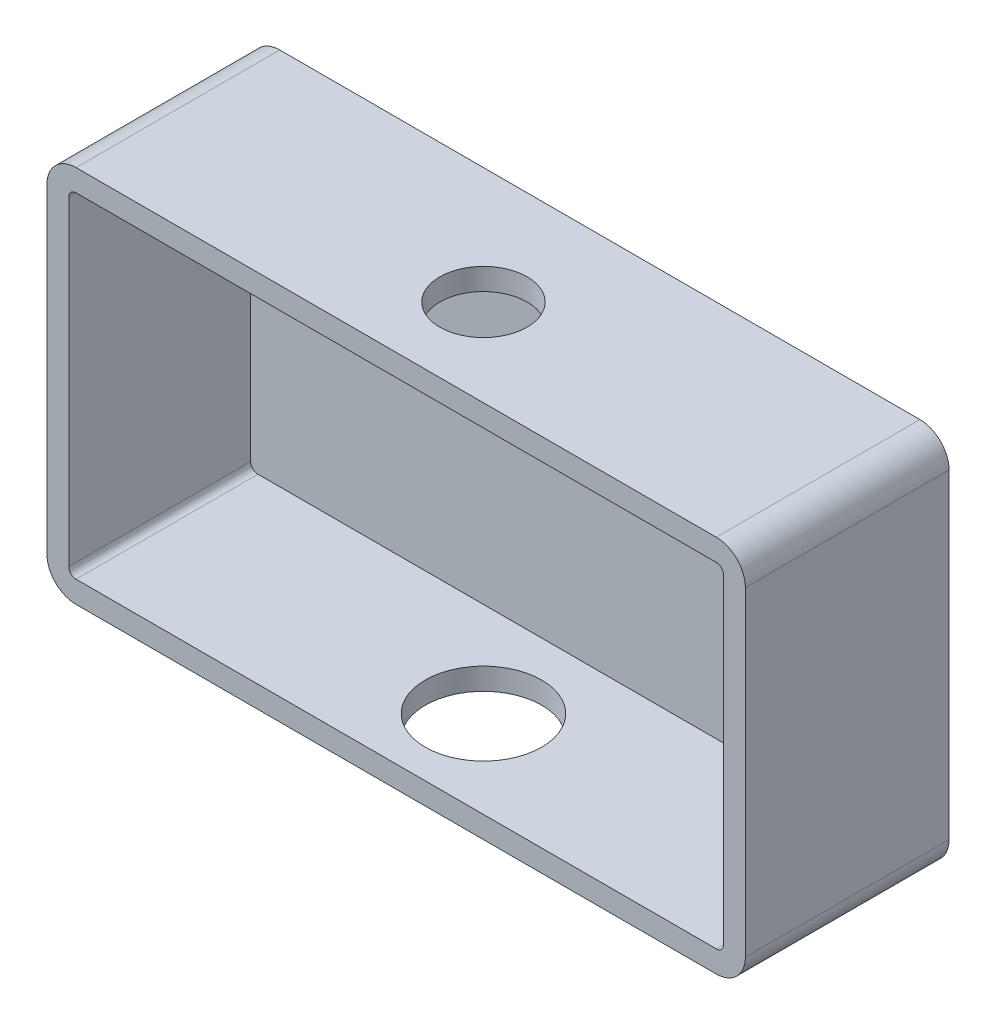
ISO-10303-21;
HEADER;
FILE_DESCRIPTION(('STEP AP214'),'2;1');
FILE_NAME('part.step','',(''),(''),'','','');
FILE_SCHEMA(('AUTOMOTIVE_DESIGN { 1 0 10303 214 1 1 1 1 }'));
ENDSEC;
DATA;
#1=APPLICATION_CONTEXT('core data for automotive mechanical design processes');
#2=APPLICATION_PROTOCOL_DEFINITION('international standard','automotive_design',2000,#1);
#3=PRODUCT_CONTEXT('',#1,'mechanical');
#4=PRODUCT('Part','Part','',(#3));
#5=PRODUCT_RELATED_PRODUCT_CATEGORY('part','',(#4));
#6=PRODUCT_DEFINITION_FORMATION('','',#4);
#7=PRODUCT_DEFINITION_CONTEXT('part definition',#1,'design');
#8=PRODUCT_DEFINITION('design','',#6,#7);
#9=PRODUCT_DEFINITION_SHAPE('','',#8);
#10=(LENGTH_UNIT() NAMED_UNIT(*) SI_UNIT(.MILLI.,.METRE.));
#11=(NAMED_UNIT(*) PLANE_ANGLE_UNIT() SI_UNIT($,.RADIAN.));
#12=(NAMED_UNIT(*) SI_UNIT($,.STERADIAN.) SOLID_ANGLE_UNIT());
#13=UNCERTAINTY_MEASURE_WITH_UNIT(LENGTH_MEASURE(1.E-05),#10,'distance_accuracy_value','');
#14=(GEOMETRIC_REPRESENTATION_CONTEXT(3) GLOBAL_UNCERTAINTY_ASSIGNED_CONTEXT((#13)) GLOBAL_UNIT_ASSIGNED_CONTEXT((#10,
#11,#12)) REPRESENTATION_CONTEXT('',''));
#15=CARTESIAN_POINT('',(0.,0.,0.));
#16=DIRECTION('',(0.,0.,1.));
#17=DIRECTION('',(1.,0.,0.));
#18=AXIS2_PLACEMENT_3D('',#15,#16,#17);
#19=CARTESIAN_POINT('',(0.,26.,14.));
#20=DIRECTION('',(1.,0.,0.));
#21=DIRECTION('',(0.,0.,-1.));
#22=AXIS2_PLACEMENT_3D('',#19,#20,#21);
#23=PLANE('',#22);
#24=DIRECTION('',(0.,-1.,0.));
#25=VECTOR('',#24,1.);
#26=CARTESIAN_POINT('',(0.,26.,14.));
#27=LINE('',#26,#25);
#28=CARTESIAN_POINT('',(0.,24.,14.));
#29=VERTEX_POINT('',#28);
#30=CARTESIAN_POINT('',(0.,2.00000000000001,14.));
#31=VERTEX_POINT('',#30);
#32=EDGE_CURVE('E205',#29,#31,#27,.T.);
#33=ORIENTED_EDGE('',*,*,#32,.F.);
#34=DIRECTION('',(0.,0.,-1.));
#35=VECTOR('',#34,1.);
#36=CARTESIAN_POINT('',(0.,24.,14.));
#37=LINE('',#36,#35);
#38=CARTESIAN_POINT('',(0.,24.,0.));
#39=VERTEX_POINT('',#38);
#40=EDGE_CURVE('E230',#29,#39,#37,.T.);
#41=ORIENTED_EDGE('',*,*,#40,.T.);
#42=DIRECTION('',(0.,-1.,0.));
#43=VECTOR('',#42,1.);
#44=CARTESIAN_POINT('',(0.,26.,0.));
#45=LINE('',#44,#43);
#46=CARTESIAN_POINT('',(0.,2.00000000000001,0.));
#47=VERTEX_POINT('',#46);
#48=EDGE_CURVE('E218',#39,#47,#45,.T.);
#49=ORIENTED_EDGE('',*,*,#48,.T.);
#50=DIRECTION('',(0.,0.,-1.));
#51=VECTOR('',#50,1.);
#52=CARTESIAN_POINT('',(0.,2.,14.));
#53=LINE('',#52,#51);
#54=EDGE_CURVE('E217',#47,#31,#53,.F.);
#55=ORIENTED_EDGE('',*,*,#54,.T.);
#56=EDGE_LOOP('',(#33,#41,#49,#55));
#57=FACE_BOUND('',#56,.T.);
#58=ADVANCED_FACE('F39',(#57),#23,.F.);
#59=CARTESIAN_POINT('',(0.,0.,14.));
#60=DIRECTION('',(0.,1.,0.));
#61=DIRECTION('',(0.,0.,1.));
#62=AXIS2_PLACEMENT_3D('',#59,#60,#61);
#63=PLANE('',#62);
#64=CARTESIAN_POINT('',(24.,0.,8.));
#65=DIRECTION('',(0.,-1.,0.));
#66=DIRECTION('',(0.,0.,-1.));
#67=AXIS2_PLACEMENT_3D('',#64,#65,#66);
#68=CIRCLE('',#67,4.);
#69=CARTESIAN_POINT('',(24.,0.,4.));
#70=VERTEX_POINT('',#69);
#71=EDGE_CURVE('E272',#70,#70,#68,.T.);
#72=ORIENTED_EDGE('',*,*,#71,.F.);
#73=EDGE_LOOP('',(#72));
#74=FACE_BOUND('',#73,.T.);
#75=DIRECTION('',(1.,0.,0.));
#76=VECTOR('',#75,1.);
#77=CARTESIAN_POINT('',(0.,0.,0.));
#78=LINE('',#77,#76);
#79=CARTESIAN_POINT('',(2.,0.,0.));
#80=VERTEX_POINT('',#79);
#81=CARTESIAN_POINT('',(46.,0.,0.));
#82=VERTEX_POINT('',#81);
#83=EDGE_CURVE('E221',#80,#82,#78,.T.);
#84=ORIENTED_EDGE('',*,*,#83,.T.);
#85=DIRECTION('',(0.,0.,-1.));
#86=VECTOR('',#85,1.);
#87=CARTESIAN_POINT('',(46.,0.,14.));
#88=LINE('',#87,#86);
#89=CARTESIAN_POINT('',(46.,0.,14.));
#90=VERTEX_POINT('',#89);
#91=EDGE_CURVE('E11',#82,#90,#88,.F.);
#92=ORIENTED_EDGE('',*,*,#91,.T.);
#93=DIRECTION('',(1.,0.,0.));
#94=VECTOR('',#93,1.);
#95=CARTESIAN_POINT('',(0.,0.,14.));
#96=LINE('',#95,#94);
#97=CARTESIAN_POINT('',(2.,0.,14.));
#98=VERTEX_POINT('',#97);
#99=EDGE_CURVE('E208',#98,#90,#96,.T.);
#100=ORIENTED_EDGE('',*,*,#99,.F.);
#101=DIRECTION('',(0.,0.,-1.));
#102=VECTOR('',#101,1.);
#103=CARTESIAN_POINT('',(2.,0.,14.));
#104=LINE('',#103,#102);
#105=EDGE_CURVE('E48',#98,#80,#104,.T.);
#106=ORIENTED_EDGE('',*,*,#105,.T.);
#107=EDGE_LOOP('',(#84,#92,#100,#106));
#108=FACE_BOUND('',#107,.T.);
#109=ADVANCED_FACE('F326',(#74,#108),#63,.F.);
#110=CARTESIAN_POINT('',(48.,0.,14.));
#111=DIRECTION('',(-1.,0.,0.));
#112=DIRECTION('',(0.,0.,1.));
#113=AXIS2_PLACEMENT_3D('',#110,#111,#112);
#114=PLANE('',#113);
#115=DIRECTION('',(0.,1.,0.));
#116=VECTOR('',#115,1.);
#117=CARTESIAN_POINT('',(48.,0.,0.));
#118=LINE('',#117,#116);
#119=CARTESIAN_POINT('',(48.,2.,0.));
#120=VERTEX_POINT('',#119);
#121=CARTESIAN_POINT('',(48.,24.,0.));
#122=VERTEX_POINT('',#121);
#123=EDGE_CURVE('E225',#120,#122,#118,.T.);
#124=ORIENTED_EDGE('',*,*,#123,.T.);
#125=DIRECTION('',(0.,0.,-1.));
#126=VECTOR('',#125,1.);
#127=CARTESIAN_POINT('',(48.,24.,14.));
#128=LINE('',#127,#126);
#129=CARTESIAN_POINT('',(48.,24.,14.));
#130=VERTEX_POINT('',#129);
#131=EDGE_CURVE('E64',#122,#130,#128,.F.);
#132=ORIENTED_EDGE('',*,*,#131,.T.);
#133=DIRECTION('',(0.,1.,0.));
#134=VECTOR('',#133,1.);
#135=CARTESIAN_POINT('',(48.,0.,14.));
#136=LINE('',#135,#134);
#137=CARTESIAN_POINT('',(48.,2.,14.));
#138=VERTEX_POINT('',#137);
#139=EDGE_CURVE('E212',#138,#130,#136,.T.);
#140=ORIENTED_EDGE('',*,*,#139,.F.);
#141=DIRECTION('',(0.,0.,-1.));
#142=VECTOR('',#141,1.);
#143=CARTESIAN_POINT('',(48.,2.,14.));
#144=LINE('',#143,#142);
#145=EDGE_CURVE('E254',#138,#120,#144,.T.);
#146=ORIENTED_EDGE('',*,*,#145,.T.);
#147=EDGE_LOOP('',(#124,#132,#140,#146));
#148=FACE_BOUND('',#147,.T.);
#149=ADVANCED_FACE('F332',(#148),#114,.F.);
#150=CARTESIAN_POINT('',(48.,26.,14.));
#151=DIRECTION('',(0.,-1.,0.));
#152=DIRECTION('',(0.,0.,-1.));
#153=AXIS2_PLACEMENT_3D('',#150,#151,#152);
#154=PLANE('',#153);
#155=CARTESIAN_POINT('',(24.,26.,8.));
#156=DIRECTION('',(0.,-1.,0.));
#157=DIRECTION('',(0.,0.,-1.));
#158=AXIS2_PLACEMENT_3D('',#155,#156,#157);
#159=CIRCLE('',#158,3.);
#160=CARTESIAN_POINT('',(24.,26.,5.));
#161=VERTEX_POINT('',#160);
#162=EDGE_CURVE('E262',#161,#161,#159,.T.);
#163=ORIENTED_EDGE('',*,*,#162,.T.);
#164=EDGE_LOOP('',(#163));
#165=FACE_BOUND('',#164,.T.);
#166=DIRECTION('',(-1.,0.,0.));
#167=VECTOR('',#166,1.);
#168=CARTESIAN_POINT('',(48.,26.,0.));
#169=LINE('',#168,#167);
#170=CARTESIAN_POINT('',(46.,26.,0.));
#171=VERTEX_POINT('',#170);
#172=CARTESIAN_POINT('',(2.,26.,0.));
#173=VERTEX_POINT('',#172);
#174=EDGE_CURVE('E209',#171,#173,#169,.T.);
#175=ORIENTED_EDGE('',*,*,#174,.T.);
#176=DIRECTION('',(0.,0.,-1.));
#177=VECTOR('',#176,1.);
#178=CARTESIAN_POINT('',(2.,26.,14.));
#179=LINE('',#178,#177);
#180=CARTESIAN_POINT('',(2.,26.,14.));
#181=VERTEX_POINT('',#180);
#182=EDGE_CURVE('E244',#173,#181,#179,.F.);
#183=ORIENTED_EDGE('',*,*,#182,.T.);
#184=DIRECTION('',(-1.,0.,0.));
#185=VECTOR('',#184,1.);
#186=CARTESIAN_POINT('',(48.,26.,14.));
#187=LINE('',#186,#185);
#188=CARTESIAN_POINT('',(46.,26.,14.));
#189=VERTEX_POINT('',#188);
#190=EDGE_CURVE('E214',#189,#181,#187,.T.);
#191=ORIENTED_EDGE('',*,*,#190,.F.);
#192=DIRECTION('',(0.,0.,-1.));
#193=VECTOR('',#192,1.);
#194=CARTESIAN_POINT('',(46.,26.,14.));
#195=LINE('',#194,#193);
#196=EDGE_CURVE('E241',#189,#171,#195,.T.);
#197=ORIENTED_EDGE('',*,*,#196,.T.);
#198=EDGE_LOOP('',(#175,#183,#191,#197));
#199=FACE_BOUND('',#198,.T.);
#200=ADVANCED_FACE('F366',(#165,#199),#154,.F.);
#201=CARTESIAN_POINT('',(0.,0.,14.));
#202=DIRECTION('',(0.,0.,1.));
#203=DIRECTION('',(1.,0.,0.));
#204=AXIS2_PLACEMENT_3D('',#201,#202,#203);
#205=PLANE('',#204);
#206=DIRECTION('',(-1.,0.,0.));
#207=VECTOR('',#206,1.);
#208=CARTESIAN_POINT('',(48.,24.5,14.));
#209=LINE('',#208,#207);
#210=CARTESIAN_POINT('',(46.,24.5,14.));
#211=VERTEX_POINT('',#210);
#212=CARTESIAN_POINT('',(2.,24.5,14.));
#213=VERTEX_POINT('',#212);
#214=EDGE_CURVE('E182',#211,#213,#209,.T.);
#215=ORIENTED_EDGE('',*,*,#214,.F.);
#216=CARTESIAN_POINT('',(46.,24.,14.));
#217=DIRECTION('',(0.,0.,1.));
#218=DIRECTION('',(1.,0.,0.));
#219=AXIS2_PLACEMENT_3D('',#216,#217,#218);
#220=CIRCLE('',#219,0.5);
#221=CARTESIAN_POINT('',(46.5,24.,14.));
#222=VERTEX_POINT('',#221);
#223=EDGE_CURVE('E197',#222,#211,#220,.T.);
#224=ORIENTED_EDGE('',*,*,#223,.F.);
#225=DIRECTION('',(0.,1.,0.));
#226=VECTOR('',#225,1.);
#227=CARTESIAN_POINT('',(46.5,0.,14.));
#228=LINE('',#227,#226);
#229=CARTESIAN_POINT('',(46.5,2.,14.));
#230=VERTEX_POINT('',#229);
#231=EDGE_CURVE('E56',#230,#222,#228,.T.);
#232=ORIENTED_EDGE('',*,*,#231,.F.);
#233=CARTESIAN_POINT('',(46.,2.,14.));
#234=DIRECTION('',(0.,0.,1.));
#235=DIRECTION('',(1.,0.,0.));
#236=AXIS2_PLACEMENT_3D('',#233,#234,#235);
#237=CIRCLE('',#236,0.5);
#238=CARTESIAN_POINT('',(46.,1.5,14.));
#239=VERTEX_POINT('',#238);
#240=EDGE_CURVE('E186',#239,#230,#237,.T.);
#241=ORIENTED_EDGE('',*,*,#240,.F.);
#242=DIRECTION('',(1.,0.,0.));
#243=VECTOR('',#242,1.);
#244=CARTESIAN_POINT('',(0.,1.5,14.));
#245=LINE('',#244,#243);
#246=CARTESIAN_POINT('',(2.,1.5,14.));
#247=VERTEX_POINT('',#246);
#248=EDGE_CURVE('E192',#247,#239,#245,.T.);
#249=ORIENTED_EDGE('',*,*,#248,.F.);
#250=CARTESIAN_POINT('',(2.,2.,14.));
#251=DIRECTION('',(0.,0.,1.));
#252=DIRECTION('',(1.,0.,0.));
#253=AXIS2_PLACEMENT_3D('',#250,#251,#252);
#254=CIRCLE('',#253,0.5);
#255=CARTESIAN_POINT('',(1.5,2.00000000000001,14.));
#256=VERTEX_POINT('',#255);
#257=EDGE_CURVE('E184',#256,#247,#254,.T.);
#258=ORIENTED_EDGE('',*,*,#257,.F.);
#259=DIRECTION('',(0.,-1.,0.));
#260=VECTOR('',#259,1.);
#261=CARTESIAN_POINT('',(1.5,26.,14.));
#262=LINE('',#261,#260);
#263=CARTESIAN_POINT('',(1.5,24.,14.));
#264=VERTEX_POINT('',#263);
#265=EDGE_CURVE('E177',#264,#256,#262,.T.);
#266=ORIENTED_EDGE('',*,*,#265,.F.);
#267=CARTESIAN_POINT('',(2.,24.,14.));
#268=DIRECTION('',(0.,0.,1.));
#269=DIRECTION('',(1.,0.,0.));
#270=AXIS2_PLACEMENT_3D('',#267,#268,#269);
#271=CIRCLE('',#270,0.5);
#272=EDGE_CURVE('E200',#213,#264,#271,.T.);
#273=ORIENTED_EDGE('',*,*,#272,.F.);
#274=EDGE_LOOP('',(#215,#224,#232,#241,#249,#258,#266,#273));
#275=FACE_BOUND('',#274,.T.);
#276=ORIENTED_EDGE('',*,*,#190,.T.);
#277=CARTESIAN_POINT('',(2.,24.,14.));
#278=DIRECTION('',(0.,0.,1.));
#279=DIRECTION('',(1.,0.,0.));
#280=AXIS2_PLACEMENT_3D('',#277,#278,#279);
#281=CIRCLE('',#280,2.);
#282=EDGE_CURVE('E252',#181,#29,#281,.T.);
#283=ORIENTED_EDGE('',*,*,#282,.T.);
#284=ORIENTED_EDGE('',*,*,#32,.T.);
#285=CARTESIAN_POINT('',(2.,2.,14.));
#286=DIRECTION('',(0.,0.,1.));
#287=DIRECTION('',(1.,0.,0.));
#288=AXIS2_PLACEMENT_3D('',#285,#286,#287);
#289=CIRCLE('',#288,2.);
#290=EDGE_CURVE('E246',#31,#98,#289,.T.);
#291=ORIENTED_EDGE('',*,*,#290,.T.);
#292=ORIENTED_EDGE('',*,*,#99,.T.);
#293=CARTESIAN_POINT('',(46.,2.,14.));
#294=DIRECTION('',(0.,0.,1.));
#295=DIRECTION('',(1.,0.,0.));
#296=AXIS2_PLACEMENT_3D('',#293,#294,#295);
#297=CIRCLE('',#296,2.);
#298=EDGE_CURVE('E248',#90,#138,#297,.T.);
#299=ORIENTED_EDGE('',*,*,#298,.T.);
#300=ORIENTED_EDGE('',*,*,#139,.T.);
#301=CARTESIAN_POINT('',(46.,24.,14.));
#302=DIRECTION('',(0.,0.,1.));
#303=DIRECTION('',(1.,0.,0.));
#304=AXIS2_PLACEMENT_3D('',#301,#302,#303);
#305=CIRCLE('',#304,2.);
#306=EDGE_CURVE('E250',#130,#189,#305,.T.);
#307=ORIENTED_EDGE('',*,*,#306,.T.);
#308=EDGE_LOOP('',(#276,#283,#284,#291,#292,#299,#300,#307));
#309=FACE_BOUND('',#308,.T.);
#310=ADVANCED_FACE('F296',(#275,#309),#205,.T.);
#311=CARTESIAN_POINT('',(0.,0.,0.));
#312=DIRECTION('',(0.,0.,1.));
#313=DIRECTION('',(1.,0.,0.));
#314=AXIS2_PLACEMENT_3D('',#311,#312,#313);
#315=PLANE('',#314);
#316=ORIENTED_EDGE('',*,*,#48,.F.);
#317=CARTESIAN_POINT('',(2.,24.,0.));
#318=DIRECTION('',(0.,0.,1.));
#319=DIRECTION('',(1.,0.,0.));
#320=AXIS2_PLACEMENT_3D('',#317,#318,#319);
#321=CIRCLE('',#320,2.);
#322=EDGE_CURVE('E239',#39,#173,#321,.F.);
#323=ORIENTED_EDGE('',*,*,#322,.T.);
#324=ORIENTED_EDGE('',*,*,#174,.F.);
#325=CARTESIAN_POINT('',(46.,24.,0.));
#326=DIRECTION('',(0.,0.,1.));
#327=DIRECTION('',(1.,0.,0.));
#328=AXIS2_PLACEMENT_3D('',#325,#326,#327);
#329=CIRCLE('',#328,2.);
#330=EDGE_CURVE('E237',#171,#122,#329,.F.);
#331=ORIENTED_EDGE('',*,*,#330,.T.);
#332=ORIENTED_EDGE('',*,*,#123,.F.);
#333=CARTESIAN_POINT('',(46.,2.,0.));
#334=DIRECTION('',(0.,0.,1.));
#335=DIRECTION('',(1.,0.,0.));
#336=AXIS2_PLACEMENT_3D('',#333,#334,#335);
#337=CIRCLE('',#336,2.);
#338=EDGE_CURVE('E235',#120,#82,#337,.F.);
#339=ORIENTED_EDGE('',*,*,#338,.T.);
#340=ORIENTED_EDGE('',*,*,#83,.F.);
#341=CARTESIAN_POINT('',(2.,2.,0.));
#342=DIRECTION('',(0.,0.,1.));
#343=DIRECTION('',(1.,0.,0.));
#344=AXIS2_PLACEMENT_3D('',#341,#342,#343);
#345=CIRCLE('',#344,2.);
#346=EDGE_CURVE('E233',#80,#47,#345,.F.);
#347=ORIENTED_EDGE('',*,*,#346,.T.);
#348=EDGE_LOOP('',(#316,#323,#324,#331,#332,#339,#340,#347));
#349=FACE_BOUND('',#348,.T.);
#350=ADVANCED_FACE('F342',(#349),#315,.F.);
#351=CARTESIAN_POINT('',(2.,24.,14.));
#352=DIRECTION('',(0.,0.,-1.));
#353=DIRECTION('',(-1.,0.,0.));
#354=AXIS2_PLACEMENT_3D('',#351,#352,#353);
#355=CYLINDRICAL_SURFACE('',#354,2.);
#356=ORIENTED_EDGE('',*,*,#282,.F.);
#357=ORIENTED_EDGE('',*,*,#182,.F.);
#358=ORIENTED_EDGE('',*,*,#322,.F.);
#359=ORIENTED_EDGE('',*,*,#40,.F.);
#360=EDGE_LOOP('',(#356,#357,#358,#359));
#361=FACE_BOUND('',#360,.T.);
#362=ADVANCED_FACE('F338',(#361),#355,.T.);
#363=CARTESIAN_POINT('',(46.,24.,14.));
#364=DIRECTION('',(0.,0.,-1.));
#365=DIRECTION('',(-1.,0.,0.));
#366=AXIS2_PLACEMENT_3D('',#363,#364,#365);
#367=CYLINDRICAL_SURFACE('',#366,2.);
#368=ORIENTED_EDGE('',*,*,#306,.F.);
#369=ORIENTED_EDGE('',*,*,#131,.F.);
#370=ORIENTED_EDGE('',*,*,#330,.F.);
#371=ORIENTED_EDGE('',*,*,#196,.F.);
#372=EDGE_LOOP('',(#368,#369,#370,#371));
#373=FACE_BOUND('',#372,.T.);
#374=ADVANCED_FACE('F341',(#373),#367,.T.);
#375=CARTESIAN_POINT('',(46.,2.,14.));
#376=DIRECTION('',(0.,0.,-1.));
#377=DIRECTION('',(-1.,0.,0.));
#378=AXIS2_PLACEMENT_3D('',#375,#376,#377);
#379=CYLINDRICAL_SURFACE('',#378,2.);
#380=ORIENTED_EDGE('',*,*,#298,.F.);
#381=ORIENTED_EDGE('',*,*,#91,.F.);
#382=ORIENTED_EDGE('',*,*,#338,.F.);
#383=ORIENTED_EDGE('',*,*,#145,.F.);
#384=EDGE_LOOP('',(#380,#381,#382,#383));
#385=FACE_BOUND('',#384,.T.);
#386=ADVANCED_FACE('F345',(#385),#379,.T.);
#387=CARTESIAN_POINT('',(2.,2.,14.));
#388=DIRECTION('',(0.,0.,-1.));
#389=DIRECTION('',(-1.,0.,0.));
#390=AXIS2_PLACEMENT_3D('',#387,#388,#389);
#391=CYLINDRICAL_SURFACE('',#390,2.);
#392=ORIENTED_EDGE('',*,*,#290,.F.);
#393=ORIENTED_EDGE('',*,*,#54,.F.);
#394=ORIENTED_EDGE('',*,*,#346,.F.);
#395=ORIENTED_EDGE('',*,*,#105,.F.);
#396=EDGE_LOOP('',(#392,#393,#394,#395));
#397=FACE_BOUND('',#396,.T.);
#398=ADVANCED_FACE('F41',(#397),#391,.T.);
#399=CARTESIAN_POINT('',(1.5,26.,14.));
#400=DIRECTION('',(1.,0.,0.));
#401=DIRECTION('',(0.,0.,-1.));
#402=AXIS2_PLACEMENT_3D('',#399,#400,#401);
#403=PLANE('',#402);
#404=ORIENTED_EDGE('',*,*,#265,.T.);
#405=DIRECTION('',(0.,0.,-1.));
#406=VECTOR('',#405,1.);
#407=CARTESIAN_POINT('',(1.5,2.00000000000001,14.));
#408=LINE('',#407,#406);
#409=CARTESIAN_POINT('',(1.5,2.00000000000001,1.5));
#410=VERTEX_POINT('',#409);
#411=EDGE_CURVE('E202',#410,#256,#408,.F.);
#412=ORIENTED_EDGE('',*,*,#411,.F.);
#413=DIRECTION('',(0.,-1.,0.));
#414=VECTOR('',#413,1.);
#415=CARTESIAN_POINT('',(1.5,26.,1.5));
#416=LINE('',#415,#414);
#417=CARTESIAN_POINT('',(1.5,24.,1.5));
#418=VERTEX_POINT('',#417);
#419=EDGE_CURVE('E261',#418,#410,#416,.T.);
#420=ORIENTED_EDGE('',*,*,#419,.F.);
#421=DIRECTION('',(0.,0.,-1.));
#422=VECTOR('',#421,1.);
#423=CARTESIAN_POINT('',(1.5,24.,14.));
#424=LINE('',#423,#422);
#425=EDGE_CURVE('E163',#264,#418,#424,.T.);
#426=ORIENTED_EDGE('',*,*,#425,.F.);
#427=EDGE_LOOP('',(#404,#412,#420,#426));
#428=FACE_BOUND('',#427,.T.);
#429=ADVANCED_FACE('F302',(#428),#403,.T.);
#430=CARTESIAN_POINT('',(0.,1.5,14.));
#431=DIRECTION('',(0.,1.,0.));
#432=DIRECTION('',(0.,0.,1.));
#433=AXIS2_PLACEMENT_3D('',#430,#431,#432);
#434=PLANE('',#433);
#435=CARTESIAN_POINT('',(24.,1.5,8.));
#436=DIRECTION('',(0.,1.,0.));
#437=DIRECTION('',(0.,0.,1.));
#438=AXIS2_PLACEMENT_3D('',#435,#436,#437);
#439=CIRCLE('',#438,4.);
#440=CARTESIAN_POINT('',(24.,1.5,12.));
#441=VERTEX_POINT('',#440);
#442=EDGE_CURVE('E43',#441,#441,#439,.T.);
#443=ORIENTED_EDGE('',*,*,#442,.F.);
#444=EDGE_LOOP('',(#443));
#445=FACE_BOUND('',#444,.T.);
#446=DIRECTION('',(1.,0.,0.));
#447=VECTOR('',#446,1.);
#448=CARTESIAN_POINT('',(0.,1.5,1.5));
#449=LINE('',#448,#447);
#450=CARTESIAN_POINT('',(2.,1.5,1.5));
#451=VERTEX_POINT('',#450);
#452=CARTESIAN_POINT('',(46.,1.5,1.5));
#453=VERTEX_POINT('',#452);
#454=EDGE_CURVE('E265',#451,#453,#449,.T.);
#455=ORIENTED_EDGE('',*,*,#454,.F.);
#456=DIRECTION('',(0.,0.,1.));
#457=VECTOR('',#456,1.);
#458=CARTESIAN_POINT('',(2.,1.5,14.));
#459=LINE('',#458,#457);
#460=EDGE_CURVE('E286',#247,#451,#459,.F.);
#461=ORIENTED_EDGE('',*,*,#460,.F.);
#462=ORIENTED_EDGE('',*,*,#248,.T.);
#463=DIRECTION('',(0.,0.,1.));
#464=VECTOR('',#463,1.);
#465=CARTESIAN_POINT('',(46.,1.5,14.));
#466=LINE('',#465,#464);
#467=EDGE_CURVE('E222',#453,#239,#466,.T.);
#468=ORIENTED_EDGE('',*,*,#467,.F.);
#469=EDGE_LOOP('',(#455,#461,#462,#468));
#470=FACE_BOUND('',#469,.T.);
#471=ADVANCED_FACE('F311',(#445,#470),#434,.T.);
#472=CARTESIAN_POINT('',(46.5,0.,14.));
#473=DIRECTION('',(-1.,0.,0.));
#474=DIRECTION('',(0.,0.,1.));
#475=AXIS2_PLACEMENT_3D('',#472,#473,#474);
#476=PLANE('',#475);
#477=DIRECTION('',(0.,1.,0.));
#478=VECTOR('',#477,1.);
#479=CARTESIAN_POINT('',(46.5,0.,1.5));
#480=LINE('',#479,#478);
#481=CARTESIAN_POINT('',(46.5,2.,1.5));
#482=VERTEX_POINT('',#481);
#483=CARTESIAN_POINT('',(46.5,24.,1.5));
#484=VERTEX_POINT('',#483);
#485=EDGE_CURVE('E178',#482,#484,#480,.T.);
#486=ORIENTED_EDGE('',*,*,#485,.F.);
#487=DIRECTION('',(0.,0.,1.));
#488=VECTOR('',#487,1.);
#489=CARTESIAN_POINT('',(46.5,2.,14.));
#490=LINE('',#489,#488);
#491=EDGE_CURVE('E204',#230,#482,#490,.F.);
#492=ORIENTED_EDGE('',*,*,#491,.F.);
#493=ORIENTED_EDGE('',*,*,#231,.T.);
#494=DIRECTION('',(0.,0.,1.));
#495=VECTOR('',#494,1.);
#496=CARTESIAN_POINT('',(46.5,24.,14.));
#497=LINE('',#496,#495);
#498=EDGE_CURVE('E289',#484,#222,#497,.T.);
#499=ORIENTED_EDGE('',*,*,#498,.F.);
#500=EDGE_LOOP('',(#486,#492,#493,#499));
#501=FACE_BOUND('',#500,.T.);
#502=ADVANCED_FACE('F314',(#501),#476,.T.);
#503=CARTESIAN_POINT('',(48.,24.5,14.));
#504=DIRECTION('',(0.,-1.,0.));
#505=DIRECTION('',(0.,0.,-1.));
#506=AXIS2_PLACEMENT_3D('',#503,#504,#505);
#507=PLANE('',#506);
#508=CARTESIAN_POINT('',(24.,24.5,8.));
#509=DIRECTION('',(0.,-1.,0.));
#510=DIRECTION('',(0.,0.,-1.));
#511=AXIS2_PLACEMENT_3D('',#508,#509,#510);
#512=CIRCLE('',#511,3.);
#513=CARTESIAN_POINT('',(24.,24.5,5.));
#514=VERTEX_POINT('',#513);
#515=EDGE_CURVE('E259',#514,#514,#512,.T.);
#516=ORIENTED_EDGE('',*,*,#515,.F.);
#517=EDGE_LOOP('',(#516));
#518=FACE_BOUND('',#517,.T.);
#519=DIRECTION('',(-1.,0.,0.));
#520=VECTOR('',#519,1.);
#521=CARTESIAN_POINT('',(48.,24.5,1.5));
#522=LINE('',#521,#520);
#523=CARTESIAN_POINT('',(46.,24.5,1.5));
#524=VERTEX_POINT('',#523);
#525=CARTESIAN_POINT('',(2.,24.5,1.5));
#526=VERTEX_POINT('',#525);
#527=EDGE_CURVE('E171',#524,#526,#522,.T.);
#528=ORIENTED_EDGE('',*,*,#527,.F.);
#529=DIRECTION('',(0.,0.,-1.));
#530=VECTOR('',#529,1.);
#531=CARTESIAN_POINT('',(46.,24.5,14.));
#532=LINE('',#531,#530);
#533=EDGE_CURVE('E167',#211,#524,#532,.T.);
#534=ORIENTED_EDGE('',*,*,#533,.F.);
#535=ORIENTED_EDGE('',*,*,#214,.T.);
#536=DIRECTION('',(0.,0.,-1.));
#537=VECTOR('',#536,1.);
#538=CARTESIAN_POINT('',(2.,24.5,14.));
#539=LINE('',#538,#537);
#540=EDGE_CURVE('E160',#526,#213,#539,.F.);
#541=ORIENTED_EDGE('',*,*,#540,.F.);
#542=EDGE_LOOP('',(#528,#534,#535,#541));
#543=FACE_BOUND('',#542,.T.);
#544=ADVANCED_FACE('F180',(#518,#543),#507,.T.);
#545=CARTESIAN_POINT('',(0.,0.,1.5));
#546=DIRECTION('',(0.,0.,1.));
#547=DIRECTION('',(1.,0.,0.));
#548=AXIS2_PLACEMENT_3D('',#545,#546,#547);
#549=PLANE('',#548);
#550=ORIENTED_EDGE('',*,*,#419,.T.);
#551=CARTESIAN_POINT('',(2.,2.,1.5));
#552=DIRECTION('',(0.,0.,1.));
#553=DIRECTION('',(1.,0.,0.));
#554=AXIS2_PLACEMENT_3D('',#551,#552,#553);
#555=CIRCLE('',#554,0.5);
#556=EDGE_CURVE('E275',#451,#410,#555,.F.);
#557=ORIENTED_EDGE('',*,*,#556,.F.);
#558=ORIENTED_EDGE('',*,*,#454,.T.);
#559=CARTESIAN_POINT('',(46.,2.,1.5));
#560=DIRECTION('',(0.,0.,1.));
#561=DIRECTION('',(1.,0.,0.));
#562=AXIS2_PLACEMENT_3D('',#559,#560,#561);
#563=CIRCLE('',#562,0.5);
#564=EDGE_CURVE('E279',#482,#453,#563,.F.);
#565=ORIENTED_EDGE('',*,*,#564,.F.);
#566=ORIENTED_EDGE('',*,*,#485,.T.);
#567=CARTESIAN_POINT('',(46.,24.,1.5));
#568=DIRECTION('',(0.,0.,1.));
#569=DIRECTION('',(1.,0.,0.));
#570=AXIS2_PLACEMENT_3D('',#567,#568,#569);
#571=CIRCLE('',#570,0.5);
#572=EDGE_CURVE('E168',#524,#484,#571,.F.);
#573=ORIENTED_EDGE('',*,*,#572,.F.);
#574=ORIENTED_EDGE('',*,*,#527,.T.);
#575=CARTESIAN_POINT('',(2.,24.,1.5));
#576=DIRECTION('',(0.,0.,1.));
#577=DIRECTION('',(1.,0.,0.));
#578=AXIS2_PLACEMENT_3D('',#575,#576,#577);
#579=CIRCLE('',#578,0.5);
#580=EDGE_CURVE('E156',#418,#526,#579,.F.);
#581=ORIENTED_EDGE('',*,*,#580,.F.);
#582=EDGE_LOOP('',(#550,#557,#558,#565,#566,#573,#574,#581));
#583=FACE_BOUND('',#582,.T.);
#584=ADVANCED_FACE('F172',(#583),#549,.T.);
#585=CARTESIAN_POINT('',(2.,24.,14.));
#586=DIRECTION('',(0.,0.,-1.));
#587=DIRECTION('',(-1.,0.,0.));
#588=AXIS2_PLACEMENT_3D('',#585,#586,#587);
#589=CYLINDRICAL_SURFACE('',#588,0.5);
#590=ORIENTED_EDGE('',*,*,#272,.T.);
#591=ORIENTED_EDGE('',*,*,#425,.T.);
#592=ORIENTED_EDGE('',*,*,#580,.T.);
#593=ORIENTED_EDGE('',*,*,#540,.T.);
#594=EDGE_LOOP('',(#590,#591,#592,#593));
#595=FACE_BOUND('',#594,.T.);
#596=ADVANCED_FACE('F158',(#595),#589,.F.);
#597=CARTESIAN_POINT('',(46.,24.,14.));
#598=DIRECTION('',(0.,0.,-1.));
#599=DIRECTION('',(-1.,0.,0.));
#600=AXIS2_PLACEMENT_3D('',#597,#598,#599);
#601=CYLINDRICAL_SURFACE('',#600,0.5);
#602=ORIENTED_EDGE('',*,*,#223,.T.);
#603=ORIENTED_EDGE('',*,*,#533,.T.);
#604=ORIENTED_EDGE('',*,*,#572,.T.);
#605=ORIENTED_EDGE('',*,*,#498,.T.);
#606=EDGE_LOOP('',(#602,#603,#604,#605));
#607=FACE_BOUND('',#606,.T.);
#608=ADVANCED_FACE('F293',(#607),#601,.F.);
#609=CARTESIAN_POINT('',(46.,2.,14.));
#610=DIRECTION('',(0.,0.,-1.));
#611=DIRECTION('',(-1.,0.,0.));
#612=AXIS2_PLACEMENT_3D('',#609,#610,#611);
#613=CYLINDRICAL_SURFACE('',#612,0.5);
#614=ORIENTED_EDGE('',*,*,#240,.T.);
#615=ORIENTED_EDGE('',*,*,#491,.T.);
#616=ORIENTED_EDGE('',*,*,#564,.T.);
#617=ORIENTED_EDGE('',*,*,#467,.T.);
#618=EDGE_LOOP('',(#614,#615,#616,#617));
#619=FACE_BOUND('',#618,.T.);
#620=ADVANCED_FACE('F313',(#619),#613,.F.);
#621=CARTESIAN_POINT('',(2.,2.,14.));
#622=DIRECTION('',(0.,0.,-1.));
#623=DIRECTION('',(-1.,0.,0.));
#624=AXIS2_PLACEMENT_3D('',#621,#622,#623);
#625=CYLINDRICAL_SURFACE('',#624,0.5);
#626=ORIENTED_EDGE('',*,*,#257,.T.);
#627=ORIENTED_EDGE('',*,*,#460,.T.);
#628=ORIENTED_EDGE('',*,*,#556,.T.);
#629=ORIENTED_EDGE('',*,*,#411,.T.);
#630=EDGE_LOOP('',(#626,#627,#628,#629));
#631=FACE_BOUND('',#630,.T.);
#632=ADVANCED_FACE('F308',(#631),#625,.F.);
#633=CARTESIAN_POINT('',(24.,26.,8.));
#634=DIRECTION('',(0.,-1.,0.));
#635=DIRECTION('',(0.,0.,-1.));
#636=AXIS2_PLACEMENT_3D('',#633,#634,#635);
#637=CYLINDRICAL_SURFACE('',#636,3.);
#638=ORIENTED_EDGE('',*,*,#515,.T.);
#639=EDGE_LOOP('',(#638));
#640=FACE_BOUND('',#639,.T.);
#641=ORIENTED_EDGE('',*,*,#162,.F.);
#642=EDGE_LOOP('',(#641));
#643=FACE_BOUND('',#642,.T.);
#644=ADVANCED_FACE('F386',(#640,#643),#637,.F.);
#645=CARTESIAN_POINT('',(24.,1.6,8.));
#646=DIRECTION('',(0.,-1.,0.));
#647=DIRECTION('',(0.,0.,-1.));
#648=AXIS2_PLACEMENT_3D('',#645,#646,#647);
#649=CYLINDRICAL_SURFACE('',#648,4.);
#650=ORIENTED_EDGE('',*,*,#442,.T.);
#651=EDGE_LOOP('',(#650));
#652=FACE_BOUND('',#651,.T.);
#653=ORIENTED_EDGE('',*,*,#71,.T.);
#654=EDGE_LOOP('',(#653));
#655=FACE_BOUND('',#654,.T.);
#656=ADVANCED_FACE('F420',(#652,#655),#649,.F.);
#657=CLOSED_SHELL('',(#58,#109,#149,#200,#310,#350,#362,#374,#386,#398,#429,#471,#502,#544,#584,
#596,#608,#620,#632,#644,#656));
#658=MANIFOLD_SOLID_BREP('B2',#657);
#659=ADVANCED_BREP_SHAPE_REPRESENTATION('',(#18,#658),#14);
#660=SHAPE_DEFINITION_REPRESENTATION(#9,#659);
ENDSEC;
END-ISO-10303-21;
